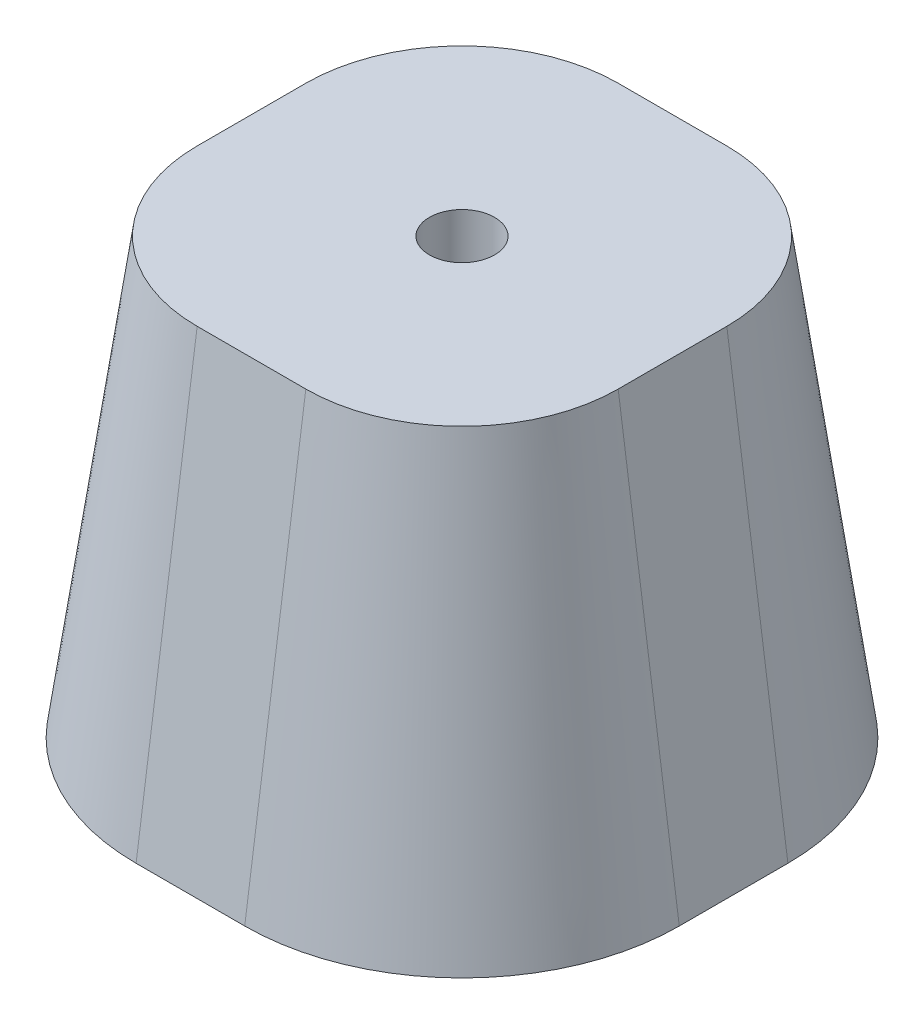
ISO-10303-21;
HEADER;
FILE_DESCRIPTION(('STEP AP214'),'2;1');
FILE_NAME('part.step','',(''),(''),'','','');
FILE_SCHEMA(('AUTOMOTIVE_DESIGN { 1 0 10303 214 1 1 1 1 }'));
ENDSEC;
DATA;
#1=APPLICATION_CONTEXT('core data for automotive mechanical design processes');
#2=APPLICATION_PROTOCOL_DEFINITION('international standard','automotive_design',2000,#1);
#3=PRODUCT_CONTEXT('',#1,'mechanical');
#4=PRODUCT('Part','Part','',(#3));
#5=PRODUCT_RELATED_PRODUCT_CATEGORY('part','',(#4));
#6=PRODUCT_DEFINITION_FORMATION('','',#4);
#7=PRODUCT_DEFINITION_CONTEXT('part definition',#1,'design');
#8=PRODUCT_DEFINITION('design','',#6,#7);
#9=PRODUCT_DEFINITION_SHAPE('','',#8);
#10=(LENGTH_UNIT() NAMED_UNIT(*) SI_UNIT(.MILLI.,.METRE.));
#11=(NAMED_UNIT(*) PLANE_ANGLE_UNIT() SI_UNIT($,.RADIAN.));
#12=(NAMED_UNIT(*) SI_UNIT($,.STERADIAN.) SOLID_ANGLE_UNIT());
#13=UNCERTAINTY_MEASURE_WITH_UNIT(LENGTH_MEASURE(1.E-05),#10,'distance_accuracy_value','');
#14=(GEOMETRIC_REPRESENTATION_CONTEXT(3) GLOBAL_UNCERTAINTY_ASSIGNED_CONTEXT((#13)) GLOBAL_UNIT_ASSIGNED_CONTEXT((#10,
#11,#12)) REPRESENTATION_CONTEXT('',''));
#15=CARTESIAN_POINT('',(0.,0.,0.));
#16=DIRECTION('',(0.,0.,1.));
#17=DIRECTION('',(1.,0.,0.));
#18=AXIS2_PLACEMENT_3D('',#15,#16,#17);
#19=CARTESIAN_POINT('',(-2.5,0.,2.50000000000001));
#20=DIRECTION('',(0.,-1.,0.));
#21=DIRECTION('',(0.,0.,-1.));
#22=AXIS2_PLACEMENT_3D('',#19,#20,#21);
#23=CONICAL_SURFACE('',#22,10.,0.139626340159547);
#24=CARTESIAN_POINT('',(-2.5,0.,2.50000000000001));
#25=DIRECTION('',(0.,1.,0.));
#26=DIRECTION('',(0.,0.,-1.));
#27=AXIS2_PLACEMENT_3D('',#24,#25,#26);
#28=CIRCLE('',#27,10.);
#29=CARTESIAN_POINT('',(-12.5,0.,2.49999999999993));
#30=VERTEX_POINT('',#29);
#31=CARTESIAN_POINT('',(-2.49999999999993,0.,12.5));
#32=VERTEX_POINT('',#31);
#33=EDGE_CURVE('E110',#30,#32,#28,.T.);
#34=ORIENTED_EDGE('',*,*,#33,.T.);
#35=DIRECTION('',(0.,-0.99026806874157,0.139173100960066));
#36=VECTOR('',#35,1.);
#37=CARTESIAN_POINT('',(-2.49999999999993,0.,12.5));
#38=LINE('',#37,#36);
#39=CARTESIAN_POINT('',(-2.49999999999993,20.,9.68918330595217));
#40=VERTEX_POINT('',#39);
#41=EDGE_CURVE('E11',#40,#32,#38,.T.);
#42=ORIENTED_EDGE('',*,*,#41,.F.);
#43=CARTESIAN_POINT('',(-2.5,20.,2.50000000000001));
#44=DIRECTION('',(0.,-1.,0.));
#45=DIRECTION('',(0.,0.,-1.));
#46=AXIS2_PLACEMENT_3D('',#43,#44,#45);
#47=CIRCLE('',#46,7.18918330595216);
#48=CARTESIAN_POINT('',(-9.68918330595217,20.,2.49999999999996));
#49=VERTEX_POINT('',#48);
#50=EDGE_CURVE('E140',#49,#40,#47,.F.);
#51=ORIENTED_EDGE('',*,*,#50,.F.);
#52=DIRECTION('',(-0.139173100960066,-0.99026806874157,0.));
#53=VECTOR('',#52,1.);
#54=CARTESIAN_POINT('',(-12.5,0.,2.49999999999994));
#55=LINE('',#54,#53);
#56=EDGE_CURVE('E122',#49,#30,#55,.T.);
#57=ORIENTED_EDGE('',*,*,#56,.T.);
#58=EDGE_LOOP('',(#34,#42,#51,#57));
#59=FACE_BOUND('',#58,.T.);
#60=ADVANCED_FACE('F40',(#59),#23,.T.);
#61=CARTESIAN_POINT('',(2.49999999999993,0.,12.5));
#62=DIRECTION('',(0.,0.139173100960066,0.99026806874157));
#63=DIRECTION('',(0.,-0.99026806874157,0.139173100960066));
#64=AXIS2_PLACEMENT_3D('',#61,#62,#63);
#65=PLANE('',#64);
#66=DIRECTION('',(1.,0.,0.));
#67=VECTOR('',#66,1.);
#68=CARTESIAN_POINT('',(2.49999999999993,0.,12.5));
#69=LINE('',#68,#67);
#70=CARTESIAN_POINT('',(2.49999999999993,0.,12.5));
#71=VERTEX_POINT('',#70);
#72=EDGE_CURVE('E106',#32,#71,#69,.T.);
#73=ORIENTED_EDGE('',*,*,#72,.T.);
#74=DIRECTION('',(0.,-0.99026806874157,0.139173100960066));
#75=VECTOR('',#74,1.);
#76=CARTESIAN_POINT('',(2.49999999999993,0.,12.5));
#77=LINE('',#76,#75);
#78=CARTESIAN_POINT('',(2.49999999999995,20.,9.68918330595217));
#79=VERTEX_POINT('',#78);
#80=EDGE_CURVE('E49',#79,#71,#77,.T.);
#81=ORIENTED_EDGE('',*,*,#80,.F.);
#82=DIRECTION('',(-1.,0.,0.));
#83=VECTOR('',#82,1.);
#84=CARTESIAN_POINT('',(-2.5,20.,9.68918330595217));
#85=LINE('',#84,#83);
#86=EDGE_CURVE('E118',#40,#79,#85,.F.);
#87=ORIENTED_EDGE('',*,*,#86,.F.);
#88=ORIENTED_EDGE('',*,*,#41,.T.);
#89=EDGE_LOOP('',(#73,#81,#87,#88));
#90=FACE_BOUND('',#89,.T.);
#91=ADVANCED_FACE('F42',(#90),#65,.T.);
#92=CARTESIAN_POINT('',(2.5,0.,2.5));
#93=DIRECTION('',(0.,-1.,0.));
#94=DIRECTION('',(0.,0.,1.));
#95=AXIS2_PLACEMENT_3D('',#92,#93,#94);
#96=CONICAL_SURFACE('',#95,10.,0.139626340159547);
#97=CARTESIAN_POINT('',(2.5,0.,2.5));
#98=DIRECTION('',(0.,1.,0.));
#99=DIRECTION('',(0.,0.,1.));
#100=AXIS2_PLACEMENT_3D('',#97,#98,#99);
#101=CIRCLE('',#100,10.);
#102=CARTESIAN_POINT('',(12.5,0.,2.49999999999993));
#103=VERTEX_POINT('',#102);
#104=EDGE_CURVE('E112',#71,#103,#101,.T.);
#105=ORIENTED_EDGE('',*,*,#104,.T.);
#106=DIRECTION('',(0.139173100960066,-0.99026806874157,0.));
#107=VECTOR('',#106,1.);
#108=CARTESIAN_POINT('',(12.5,0.,2.49999999999993));
#109=LINE('',#108,#107);
#110=CARTESIAN_POINT('',(9.68918330595216,20.,2.49999999999993));
#111=VERTEX_POINT('',#110);
#112=EDGE_CURVE('E155',#111,#103,#109,.T.);
#113=ORIENTED_EDGE('',*,*,#112,.F.);
#114=CARTESIAN_POINT('',(2.5,20.,2.5));
#115=DIRECTION('',(0.,-1.,0.));
#116=DIRECTION('',(0.,0.,-1.));
#117=AXIS2_PLACEMENT_3D('',#114,#115,#116);
#118=CIRCLE('',#117,7.18918330595216);
#119=EDGE_CURVE('E161',#79,#111,#118,.F.);
#120=ORIENTED_EDGE('',*,*,#119,.F.);
#121=ORIENTED_EDGE('',*,*,#80,.T.);
#122=EDGE_LOOP('',(#105,#113,#120,#121));
#123=FACE_BOUND('',#122,.T.);
#124=ADVANCED_FACE('F184',(#123),#96,.T.);
#125=CARTESIAN_POINT('',(12.5,0.,2.49999999999993));
#126=DIRECTION('',(0.99026806874157,0.139173100960066,0.));
#127=DIRECTION('',(-0.139173100960066,0.99026806874157,0.));
#128=AXIS2_PLACEMENT_3D('',#125,#126,#127);
#129=PLANE('',#128);
#130=DIRECTION('',(0.,0.,-1.));
#131=VECTOR('',#130,1.);
#132=CARTESIAN_POINT('',(12.5,0.,2.49999999999993));
#133=LINE('',#132,#131);
#134=CARTESIAN_POINT('',(12.5,0.,-2.49999999999993));
#135=VERTEX_POINT('',#134);
#136=EDGE_CURVE('E131',#103,#135,#133,.T.);
#137=ORIENTED_EDGE('',*,*,#136,.T.);
#138=DIRECTION('',(0.139173100960066,-0.99026806874157,0.));
#139=VECTOR('',#138,1.);
#140=CARTESIAN_POINT('',(12.5,0.,-2.49999999999993));
#141=LINE('',#140,#139);
#142=CARTESIAN_POINT('',(9.68918330595216,20.,-2.49999999999995));
#143=VERTEX_POINT('',#142);
#144=EDGE_CURVE('E152',#143,#135,#141,.T.);
#145=ORIENTED_EDGE('',*,*,#144,.F.);
#146=DIRECTION('',(0.,0.,1.));
#147=VECTOR('',#146,1.);
#148=CARTESIAN_POINT('',(9.68918330595216,20.,2.50000000000001));
#149=LINE('',#148,#147);
#150=EDGE_CURVE('E163',#111,#143,#149,.F.);
#151=ORIENTED_EDGE('',*,*,#150,.F.);
#152=ORIENTED_EDGE('',*,*,#112,.T.);
#153=EDGE_LOOP('',(#137,#145,#151,#152));
#154=FACE_BOUND('',#153,.T.);
#155=ADVANCED_FACE('F188',(#154),#129,.T.);
#156=CARTESIAN_POINT('',(2.5,0.,-2.5));
#157=DIRECTION('',(0.,-1.,0.));
#158=DIRECTION('',(0.,0.,1.));
#159=AXIS2_PLACEMENT_3D('',#156,#157,#158);
#160=CONICAL_SURFACE('',#159,10.,0.139626340159547);
#161=CARTESIAN_POINT('',(2.5,0.,-2.5));
#162=DIRECTION('',(0.,1.,0.));
#163=DIRECTION('',(0.,0.,1.));
#164=AXIS2_PLACEMENT_3D('',#161,#162,#163);
#165=CIRCLE('',#164,10.);
#166=CARTESIAN_POINT('',(2.49999999999993,0.,-12.5));
#167=VERTEX_POINT('',#166);
#168=EDGE_CURVE('E133',#135,#167,#165,.T.);
#169=ORIENTED_EDGE('',*,*,#168,.T.);
#170=DIRECTION('',(0.,-0.99026806874157,-0.139173100960066));
#171=VECTOR('',#170,1.);
#172=CARTESIAN_POINT('',(2.49999999999993,0.,-12.5));
#173=LINE('',#172,#171);
#174=CARTESIAN_POINT('',(2.49999999999993,20.,-9.68918330595216));
#175=VERTEX_POINT('',#174);
#176=EDGE_CURVE('E149',#175,#167,#173,.T.);
#177=ORIENTED_EDGE('',*,*,#176,.F.);
#178=CARTESIAN_POINT('',(2.5,20.,-2.5));
#179=DIRECTION('',(0.,-1.,0.));
#180=DIRECTION('',(0.,0.,-1.));
#181=AXIS2_PLACEMENT_3D('',#178,#179,#180);
#182=CIRCLE('',#181,7.18918330595216);
#183=EDGE_CURVE('E165',#143,#175,#182,.F.);
#184=ORIENTED_EDGE('',*,*,#183,.F.);
#185=ORIENTED_EDGE('',*,*,#144,.T.);
#186=EDGE_LOOP('',(#169,#177,#184,#185));
#187=FACE_BOUND('',#186,.T.);
#188=ADVANCED_FACE('F191',(#187),#160,.T.);
#189=CARTESIAN_POINT('',(2.49999999999993,0.,-12.5));
#190=DIRECTION('',(0.,0.139173100960066,-0.99026806874157));
#191=DIRECTION('',(0.,0.99026806874157,0.139173100960066));
#192=AXIS2_PLACEMENT_3D('',#189,#190,#191);
#193=PLANE('',#192);
#194=DIRECTION('',(-1.,0.,0.));
#195=VECTOR('',#194,1.);
#196=CARTESIAN_POINT('',(2.49999999999993,0.,-12.5));
#197=LINE('',#196,#195);
#198=CARTESIAN_POINT('',(-2.49999999999993,0.,-12.5));
#199=VERTEX_POINT('',#198);
#200=EDGE_CURVE('E135',#167,#199,#197,.T.);
#201=ORIENTED_EDGE('',*,*,#200,.T.);
#202=DIRECTION('',(0.,-0.99026806874157,-0.139173100960066));
#203=VECTOR('',#202,1.);
#204=CARTESIAN_POINT('',(-2.49999999999993,0.,-12.5));
#205=LINE('',#204,#203);
#206=CARTESIAN_POINT('',(-2.49999999999995,20.,-9.68918330595216));
#207=VERTEX_POINT('',#206);
#208=EDGE_CURVE('E146',#207,#199,#205,.T.);
#209=ORIENTED_EDGE('',*,*,#208,.F.);
#210=DIRECTION('',(1.,0.,0.));
#211=VECTOR('',#210,1.);
#212=CARTESIAN_POINT('',(-2.5,20.,-9.68918330595216));
#213=LINE('',#212,#211);
#214=EDGE_CURVE('E167',#175,#207,#213,.F.);
#215=ORIENTED_EDGE('',*,*,#214,.F.);
#216=ORIENTED_EDGE('',*,*,#176,.T.);
#217=EDGE_LOOP('',(#201,#209,#215,#216));
#218=FACE_BOUND('',#217,.T.);
#219=ADVANCED_FACE('F174',(#218),#193,.T.);
#220=CARTESIAN_POINT('',(-2.5,0.,-2.5));
#221=DIRECTION('',(0.,-1.,0.));
#222=DIRECTION('',(0.,0.,-1.));
#223=AXIS2_PLACEMENT_3D('',#220,#221,#222);
#224=CONICAL_SURFACE('',#223,10.,0.139626340159547);
#225=CARTESIAN_POINT('',(-2.5,0.,-2.5));
#226=DIRECTION('',(0.,1.,0.));
#227=DIRECTION('',(0.,0.,-1.));
#228=AXIS2_PLACEMENT_3D('',#225,#226,#227);
#229=CIRCLE('',#228,10.);
#230=CARTESIAN_POINT('',(-12.5,0.,-2.49999999999992));
#231=VERTEX_POINT('',#230);
#232=EDGE_CURVE('E137',#199,#231,#229,.T.);
#233=ORIENTED_EDGE('',*,*,#232,.T.);
#234=DIRECTION('',(-0.139173100960066,-0.99026806874157,0.));
#235=VECTOR('',#234,1.);
#236=CARTESIAN_POINT('',(-12.5,0.,-2.49999999999992));
#237=LINE('',#236,#235);
#238=CARTESIAN_POINT('',(-9.68918330595217,20.,-2.49999999999992));
#239=VERTEX_POINT('',#238);
#240=EDGE_CURVE('E143',#239,#231,#237,.T.);
#241=ORIENTED_EDGE('',*,*,#240,.F.);
#242=CARTESIAN_POINT('',(-2.5,20.,-2.5));
#243=DIRECTION('',(0.,-1.,0.));
#244=DIRECTION('',(0.,0.,-1.));
#245=AXIS2_PLACEMENT_3D('',#242,#243,#244);
#246=CIRCLE('',#245,7.18918330595216);
#247=EDGE_CURVE('E61',#207,#239,#246,.F.);
#248=ORIENTED_EDGE('',*,*,#247,.F.);
#249=ORIENTED_EDGE('',*,*,#208,.T.);
#250=EDGE_LOOP('',(#233,#241,#248,#249));
#251=FACE_BOUND('',#250,.T.);
#252=ADVANCED_FACE('F178',(#251),#224,.T.);
#253=CARTESIAN_POINT('',(-12.5,0.,2.49999999999993));
#254=DIRECTION('',(-0.99026806874157,0.139173100960066,0.));
#255=DIRECTION('',(-0.139173100960066,-0.99026806874157,0.));
#256=AXIS2_PLACEMENT_3D('',#253,#254,#255);
#257=PLANE('',#256);
#258=DIRECTION('',(0.,0.,1.));
#259=VECTOR('',#258,1.);
#260=CARTESIAN_POINT('',(-12.5,0.,2.49999999999993));
#261=LINE('',#260,#259);
#262=EDGE_CURVE('E139',#231,#30,#261,.T.);
#263=ORIENTED_EDGE('',*,*,#262,.T.);
#264=ORIENTED_EDGE('',*,*,#56,.F.);
#265=DIRECTION('',(0.,0.,-1.));
#266=VECTOR('',#265,1.);
#267=CARTESIAN_POINT('',(-9.68918330595217,20.,2.50000000000001));
#268=LINE('',#267,#266);
#269=EDGE_CURVE('E44',#239,#49,#268,.F.);
#270=ORIENTED_EDGE('',*,*,#269,.F.);
#271=ORIENTED_EDGE('',*,*,#240,.T.);
#272=EDGE_LOOP('',(#263,#264,#270,#271));
#273=FACE_BOUND('',#272,.T.);
#274=ADVANCED_FACE('F180',(#273),#257,.T.);
#275=CARTESIAN_POINT('',(-2.5,20.,2.50000000000001));
#276=DIRECTION('',(0.,-1.,0.));
#277=DIRECTION('',(0.,0.,-1.));
#278=AXIS2_PLACEMENT_3D('',#275,#276,#277);
#279=PLANE('',#278);
#280=CARTESIAN_POINT('',(0.,20.,0.));
#281=DIRECTION('',(0.,1.,0.));
#282=DIRECTION('',(0.,0.,1.));
#283=AXIS2_PLACEMENT_3D('',#280,#281,#282);
#284=CIRCLE('',#283,1.5);
#285=CARTESIAN_POINT('',(0.,20.,1.5));
#286=VERTEX_POINT('',#285);
#287=EDGE_CURVE('E126',#286,#286,#284,.T.);
#288=ORIENTED_EDGE('',*,*,#287,.F.);
#289=EDGE_LOOP('',(#288));
#290=FACE_BOUND('',#289,.T.);
#291=ORIENTED_EDGE('',*,*,#50,.T.);
#292=ORIENTED_EDGE('',*,*,#86,.T.);
#293=ORIENTED_EDGE('',*,*,#119,.T.);
#294=ORIENTED_EDGE('',*,*,#150,.T.);
#295=ORIENTED_EDGE('',*,*,#183,.T.);
#296=ORIENTED_EDGE('',*,*,#214,.T.);
#297=ORIENTED_EDGE('',*,*,#247,.T.);
#298=ORIENTED_EDGE('',*,*,#269,.T.);
#299=EDGE_LOOP('',(#291,#292,#293,#294,#295,#296,#297,#298));
#300=FACE_BOUND('',#299,.T.);
#301=ADVANCED_FACE('F170',(#290,#300),#279,.F.);
#302=CARTESIAN_POINT('',(-2.5,0.,2.50000000000001));
#303=DIRECTION('',(0.,-1.,0.));
#304=DIRECTION('',(0.,0.,-1.));
#305=AXIS2_PLACEMENT_3D('',#302,#303,#304);
#306=PLANE('',#305);
#307=ORIENTED_EDGE('',*,*,#33,.F.);
#308=ORIENTED_EDGE('',*,*,#262,.F.);
#309=ORIENTED_EDGE('',*,*,#232,.F.);
#310=ORIENTED_EDGE('',*,*,#200,.F.);
#311=ORIENTED_EDGE('',*,*,#168,.F.);
#312=ORIENTED_EDGE('',*,*,#136,.F.);
#313=ORIENTED_EDGE('',*,*,#104,.F.);
#314=ORIENTED_EDGE('',*,*,#72,.F.);
#315=EDGE_LOOP('',(#307,#308,#309,#310,#311,#312,#313,#314));
#316=FACE_BOUND('',#315,.T.);
#317=ADVANCED_FACE('F107',(#316),#306,.T.);
#318=CARTESIAN_POINT('',(0.,12.,0.));
#319=DIRECTION('',(0.,1.,0.));
#320=DIRECTION('',(0.,0.,1.));
#321=AXIS2_PLACEMENT_3D('',#318,#319,#320);
#322=CYLINDRICAL_SURFACE('',#321,1.5);
#323=CARTESIAN_POINT('',(0.,12.,0.));
#324=DIRECTION('',(0.,1.,0.));
#325=DIRECTION('',(0.,0.,1.));
#326=AXIS2_PLACEMENT_3D('',#323,#324,#325);
#327=CIRCLE('',#326,1.5);
#328=CARTESIAN_POINT('',(0.,12.,1.5));
#329=VERTEX_POINT('',#328);
#330=EDGE_CURVE('E123',#329,#329,#327,.T.);
#331=ORIENTED_EDGE('',*,*,#330,.F.);
#332=EDGE_LOOP('',(#331));
#333=FACE_BOUND('',#332,.T.);
#334=ORIENTED_EDGE('',*,*,#287,.T.);
#335=EDGE_LOOP('',(#334));
#336=FACE_BOUND('',#335,.T.);
#337=ADVANCED_FACE('F232',(#333,#336),#322,.F.);
#338=CARTESIAN_POINT('',(0.,12.,0.));
#339=DIRECTION('',(0.,1.,0.));
#340=DIRECTION('',(0.,0.,1.));
#341=AXIS2_PLACEMENT_3D('',#338,#339,#340);
#342=PLANE('',#341);
#343=ORIENTED_EDGE('',*,*,#330,.T.);
#344=EDGE_LOOP('',(#343));
#345=FACE_BOUND('',#344,.T.);
#346=ADVANCED_FACE('F237',(#345),#342,.T.);
#347=CLOSED_SHELL('',(#60,#91,#124,#155,#188,#219,#252,#274,#301,#317,#337,#346));
#348=MANIFOLD_SOLID_BREP('B2',#347);
#349=ADVANCED_BREP_SHAPE_REPRESENTATION('',(#18,#348),#14);
#350=SHAPE_DEFINITION_REPRESENTATION(#9,#349);
ENDSEC;
END-ISO-10303-21;
